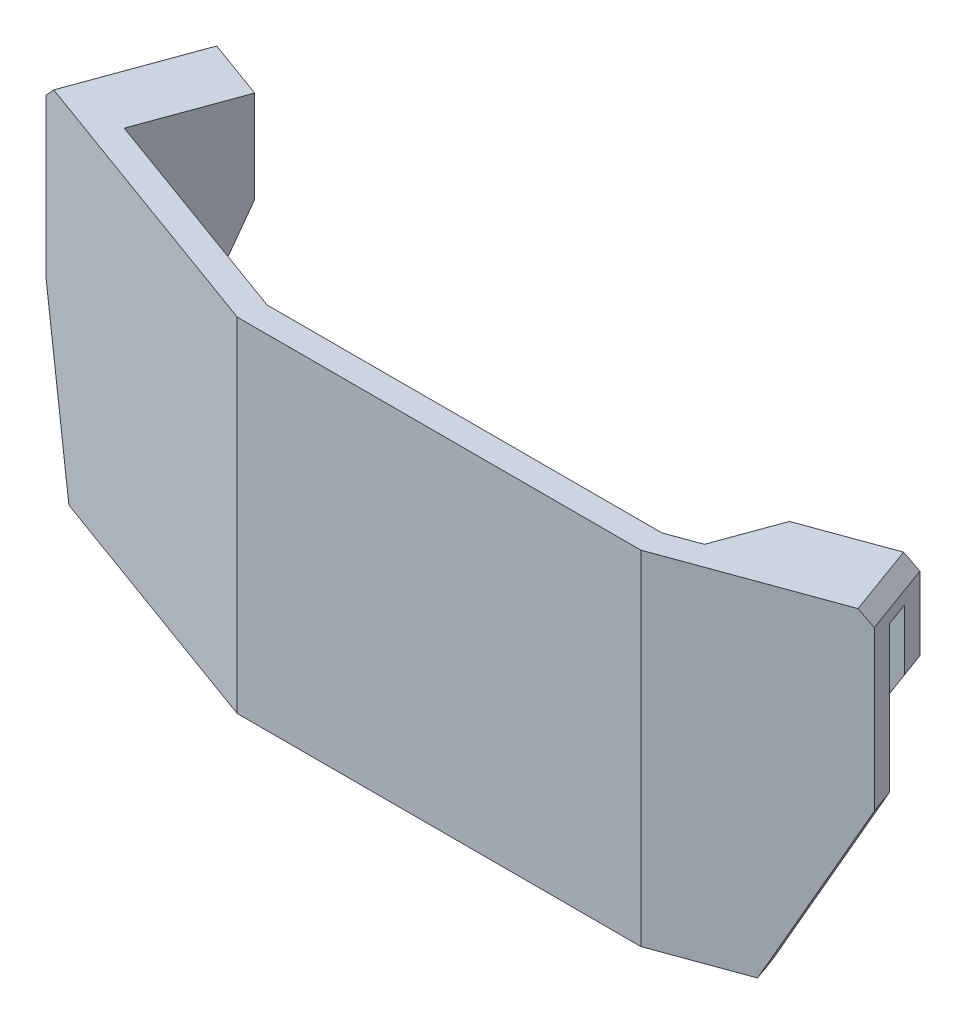
ISO-10303-21;
HEADER;
FILE_DESCRIPTION(('STEP AP214'),'2;1');
FILE_NAME('part.step','',(''),(''),'','','');
FILE_SCHEMA(('AUTOMOTIVE_DESIGN { 1 0 10303 214 1 1 1 1 }'));
ENDSEC;
DATA;
#1=APPLICATION_CONTEXT('core data for automotive mechanical design processes');
#2=APPLICATION_PROTOCOL_DEFINITION('international standard','automotive_design',2000,#1);
#3=PRODUCT_CONTEXT('',#1,'mechanical');
#4=PRODUCT('Part','Part','',(#3));
#5=PRODUCT_RELATED_PRODUCT_CATEGORY('part','',(#4));
#6=PRODUCT_DEFINITION_FORMATION('','',#4);
#7=PRODUCT_DEFINITION_CONTEXT('part definition',#1,'design');
#8=PRODUCT_DEFINITION('design','',#6,#7);
#9=PRODUCT_DEFINITION_SHAPE('','',#8);
#10=(LENGTH_UNIT() NAMED_UNIT(*) SI_UNIT(.MILLI.,.METRE.));
#11=(NAMED_UNIT(*) PLANE_ANGLE_UNIT() SI_UNIT($,.RADIAN.));
#12=(NAMED_UNIT(*) SI_UNIT($,.STERADIAN.) SOLID_ANGLE_UNIT());
#13=UNCERTAINTY_MEASURE_WITH_UNIT(LENGTH_MEASURE(1.E-05),#10,'distance_accuracy_value','');
#14=(GEOMETRIC_REPRESENTATION_CONTEXT(3) GLOBAL_UNCERTAINTY_ASSIGNED_CONTEXT((#13)) GLOBAL_UNIT_ASSIGNED_CONTEXT((#10,
#11,#12)) REPRESENTATION_CONTEXT('',''));
#15=CARTESIAN_POINT('',(0.,0.,0.));
#16=DIRECTION('',(0.,0.,1.));
#17=DIRECTION('',(1.,0.,0.));
#18=AXIS2_PLACEMENT_3D('',#15,#16,#17);
#19=CARTESIAN_POINT('',(0.,0.,0.));
#20=DIRECTION('',(0.,1.,0.));
#21=DIRECTION('',(0.,0.,1.));
#22=AXIS2_PLACEMENT_3D('',#19,#20,#21);
#23=PLANE('',#22);
#24=DIRECTION('',(-0.939692620785903,0.,0.342020143325683));
#25=VECTOR('',#24,1.);
#26=CARTESIAN_POINT('',(27.9629996487587,0.,-6.65645346904802));
#27=LINE('',#26,#25);
#28=CARTESIAN_POINT('',(27.9629996487587,0.,-6.65645346904802));
#29=VERTEX_POINT('',#28);
#30=CARTESIAN_POINT('',(18.8684672194286,0.,-3.346314370203));
#31=VERTEX_POINT('',#30);
#32=EDGE_CURVE('E490',#29,#31,#27,.T.);
#33=ORIENTED_EDGE('',*,*,#32,.F.);
#34=DIRECTION('',(-0.342020143325684,0.,-0.939692620785903));
#35=VECTOR('',#34,1.);
#36=CARTESIAN_POINT('',(27.2789593621074,0.,-8.53583871061982));
#37=LINE('',#36,#35);
#38=CARTESIAN_POINT('',(28.6470399354101,0.,-4.77706822747623));
#39=VERTEX_POINT('',#38);
#40=EDGE_CURVE('E324',#39,#29,#37,.T.);
#41=ORIENTED_EDGE('',*,*,#40,.F.);
#42=DIRECTION('',(0.939692620785903,0.,-0.342020143325684));
#43=VECTOR('',#42,1.);
#44=CARTESIAN_POINT('',(17.975516043037,0.,-0.892951176391627));
#45=LINE('',#44,#43);
#46=CARTESIAN_POINT('',(17.975516043037,0.,-0.892951176391627));
#47=VERTEX_POINT('',#46);
#48=EDGE_CURVE('E307',#47,#39,#45,.T.);
#49=ORIENTED_EDGE('',*,*,#48,.F.);
#50=DIRECTION('',(-0.342020143325656,0.,0.939692620785913));
#51=VECTOR('',#50,1.);
#52=CARTESIAN_POINT('',(19.7614183958202,0.,-5.79967756401436));
#53=LINE('',#52,#51);
#54=EDGE_CURVE('E318',#31,#47,#53,.T.);
#55=ORIENTED_EDGE('',*,*,#54,.F.);
#56=EDGE_LOOP('',(#33,#41,#49,#55));
#57=FACE_BOUND('',#56,.T.);
#58=ADVANCED_FACE('F46',(#57),#23,.F.);
#59=DIRECTION('',(0.342020143325655,0.,-0.939692620785913));
#60=VECTOR('',#59,1.);
#61=CARTESIAN_POINT('',(-32.3226334429452,0.,-14.6282970372879));
#62=LINE('',#61,#60);
#63=CARTESIAN_POINT('',(-35.0587945895505,0.,-7.11075607100055));
#64=VERTEX_POINT('',#63);
#65=CARTESIAN_POINT('',(-32.3226334429452,0.,-14.6282970372879));
#66=VERTEX_POINT('',#65);
#67=EDGE_CURVE('E268',#64,#66,#62,.T.);
#68=ORIENTED_EDGE('',*,*,#67,.F.);
#69=DIRECTION('',(0.939692620785913,0.,0.342020143325655));
#70=VECTOR('',#69,1.);
#71=CARTESIAN_POINT('',(-33.1794093479786,0.,-6.42671578434923));
#72=LINE('',#71,#70);
#73=CARTESIAN_POINT('',(-38.8175650726941,0.,-8.47883664430316));
#74=VERTEX_POINT('',#73);
#75=EDGE_CURVE('E280',#74,#64,#72,.T.);
#76=ORIENTED_EDGE('',*,*,#75,.F.);
#77=DIRECTION('',(-0.342020143325655,0.,0.939692620785913));
#78=VECTOR('',#77,1.);
#79=CARTESIAN_POINT('',(-39.5016053593454,0.,-6.59945140273135));
#80=LINE('',#79,#78);
#81=CARTESIAN_POINT('',(-38.1335247860428,0.,-10.358221885875));
#82=VERTEX_POINT('',#81);
#83=EDGE_CURVE('E360',#82,#74,#80,.T.);
#84=ORIENTED_EDGE('',*,*,#83,.F.);
#85=DIRECTION('',(-0.939692620785913,0.,-0.342020143325655));
#86=VECTOR('',#85,1.);
#87=CARTESIAN_POINT('',(-38.1335247860428,0.,-10.358221885875));
#88=LINE('',#87,#86);
#89=CARTESIAN_POINT('',(-36.254139544471,0.,-9.67418159922368));
#90=VERTEX_POINT('',#89);
#91=EDGE_CURVE('E265',#90,#82,#88,.T.);
#92=ORIENTED_EDGE('',*,*,#91,.F.);
#93=DIRECTION('',(-0.342020143325656,0.,0.939692620785913));
#94=VECTOR('',#93,1.);
#95=CARTESIAN_POINT('',(-36.254139544471,0.,-9.67418159922368));
#96=LINE('',#95,#94);
#97=CARTESIAN_POINT('',(-34.202018684517,0.,-15.3123373239392));
#98=VERTEX_POINT('',#97);
#99=EDGE_CURVE('E261',#98,#90,#96,.T.);
#100=ORIENTED_EDGE('',*,*,#99,.F.);
#101=DIRECTION('',(-0.939692620785913,0.,-0.342020143325655));
#102=VECTOR('',#101,1.);
#103=CARTESIAN_POINT('',(-36.0814039260889,0.,-15.9963776105905));
#104=LINE('',#103,#102);
#105=EDGE_CURVE('E356',#66,#98,#104,.T.);
#106=ORIENTED_EDGE('',*,*,#105,.F.);
#107=EDGE_LOOP('',(#68,#76,#84,#92,#100,#106));
#108=FACE_BOUND('',#107,.T.);
#109=ADVANCED_FACE('F538',(#108),#23,.F.);
#110=CARTESIAN_POINT('',(-33.1794093479786,2.,-6.42671578434923));
#111=DIRECTION('',(-0.342020143325655,0.,0.939692620785913));
#112=DIRECTION('',(0.939692620785913,0.,0.342020143325655));
#113=AXIS2_PLACEMENT_3D('',#110,#111,#112);
#114=PLANE('',#113);
#115=DIRECTION('',(0.939692620785913,0.,0.342020143325655));
#116=VECTOR('',#115,1.);
#117=CARTESIAN_POINT('',(-38.8175650726941,-25.,-8.47883664430316));
#118=LINE('',#117,#116);
#119=CARTESIAN_POINT('',(-35.9984872103364,-25.,-7.45277621432619));
#120=VERTEX_POINT('',#119);
#121=CARTESIAN_POINT('',(-15.5221528492257,-25.,0.));
#122=VERTEX_POINT('',#121);
#123=EDGE_CURVE('E281',#120,#122,#118,.T.);
#124=ORIENTED_EDGE('',*,*,#123,.F.);
#125=DIRECTION('',(0.203847950435901,-0.976187060183953,0.0741945862748368));
#126=VECTOR('',#125,1.);
#127=CARTESIAN_POINT('',(-35.9984872103364,-25.,-7.4527762143262));
#128=LINE('',#127,#126);
#129=CARTESIAN_POINT('',(-38.8175650726941,-11.5,-8.47883664430316));
#130=VERTEX_POINT('',#129);
#131=EDGE_CURVE('E553',#130,#120,#128,.T.);
#132=ORIENTED_EDGE('',*,*,#131,.F.);
#133=DIRECTION('',(0.,1.,0.));
#134=VECTOR('',#133,1.);
#135=CARTESIAN_POINT('',(-38.8175650726941,-25.,-8.47883664430316));
#136=LINE('',#135,#134);
#137=EDGE_CURVE('E315',#130,#74,#136,.T.);
#138=ORIENTED_EDGE('',*,*,#137,.T.);
#139=ORIENTED_EDGE('',*,*,#75,.T.);
#140=DIRECTION('',(0.,1.,0.));
#141=VECTOR('',#140,1.);
#142=CARTESIAN_POINT('',(-35.0587945895505,-11.5,-7.11075607100055));
#143=LINE('',#142,#141);
#144=CARTESIAN_POINT('',(-35.0587945895505,-11.5,-7.11075607100055));
#145=VERTEX_POINT('',#144);
#146=EDGE_CURVE('E493',#145,#64,#143,.T.);
#147=ORIENTED_EDGE('',*,*,#146,.F.);
#148=DIRECTION('',(-0.939692620785913,0.,-0.342020143325656));
#149=VECTOR('',#148,1.);
#150=CARTESIAN_POINT('',(-35.0587945895505,-11.5,-7.11075607100055));
#151=LINE('',#150,#149);
#152=CARTESIAN_POINT('',(-33.1794093479786,-11.5,-6.42671578434923));
#153=VERTEX_POINT('',#152);
#154=EDGE_CURVE('E513',#153,#145,#151,.T.);
#155=ORIENTED_EDGE('',*,*,#154,.F.);
#156=DIRECTION('',(0.,-1.,0.));
#157=VECTOR('',#156,1.);
#158=CARTESIAN_POINT('',(-33.1794093479786,2.,-6.42671578434923));
#159=LINE('',#158,#157);
#160=CARTESIAN_POINT('',(-33.1794093479786,2.,-6.42671578434923));
#161=VERTEX_POINT('',#160);
#162=EDGE_CURVE('E391',#161,#153,#159,.T.);
#163=ORIENTED_EDGE('',*,*,#162,.F.);
#164=DIRECTION('',(-0.939692620785913,0.,-0.342020143325655));
#165=VECTOR('',#164,1.);
#166=CARTESIAN_POINT('',(-33.1794093479786,2.,-6.42671578434923));
#167=LINE('',#166,#165);
#168=CARTESIAN_POINT('',(-15.5221528492257,2.,0.));
#169=VERTEX_POINT('',#168);
#170=EDGE_CURVE('E330',#169,#161,#167,.T.);
#171=ORIENTED_EDGE('',*,*,#170,.F.);
#172=DIRECTION('',(0.,-1.,0.));
#173=VECTOR('',#172,1.);
#174=CARTESIAN_POINT('',(-15.5221528492257,2.,0.));
#175=LINE('',#174,#173);
#176=EDGE_CURVE('E395',#169,#122,#175,.T.);
#177=ORIENTED_EDGE('',*,*,#176,.T.);
#178=EDGE_LOOP('',(#124,#132,#138,#139,#147,#155,#163,#171,#177));
#179=FACE_BOUND('',#178,.T.);
#180=ADVANCED_FACE('F529',(#179),#114,.F.);
#181=CARTESIAN_POINT('',(19.7614183958202,2.,-5.79967756401436));
#182=DIRECTION('',(0.939692620785913,0.,0.342020143325656));
#183=DIRECTION('',(0.342020143325656,0.,-0.939692620785913));
#184=AXIS2_PLACEMENT_3D('',#181,#182,#183);
#185=PLANE('',#184);
#186=DIRECTION('',(0.,-1.,0.));
#187=VECTOR('',#186,1.);
#188=CARTESIAN_POINT('',(19.7614183958202,2.,-5.79967756401436));
#189=LINE('',#188,#187);
#190=CARTESIAN_POINT('',(19.7614183958202,2.,-5.79967756401436));
#191=VERTEX_POINT('',#190);
#192=CARTESIAN_POINT('',(19.7614183958202,-11.5,-5.79967756401436));
#193=VERTEX_POINT('',#192);
#194=EDGE_CURVE('E353',#191,#193,#189,.T.);
#195=ORIENTED_EDGE('',*,*,#194,.T.);
#196=DIRECTION('',(0.342020143325661,0.,-0.939692620785911));
#197=VECTOR('',#196,1.);
#198=CARTESIAN_POINT('',(18.8684672194286,-11.5,-3.346314370203));
#199=LINE('',#198,#197);
#200=CARTESIAN_POINT('',(18.8684672194286,-11.5,-3.346314370203));
#201=VERTEX_POINT('',#200);
#202=EDGE_CURVE('E494',#201,#193,#199,.T.);
#203=ORIENTED_EDGE('',*,*,#202,.F.);
#204=DIRECTION('',(0.,1.,0.));
#205=VECTOR('',#204,1.);
#206=CARTESIAN_POINT('',(18.8684672194286,-11.5,-3.346314370203));
#207=LINE('',#206,#205);
#208=EDGE_CURVE('E485',#201,#31,#207,.T.);
#209=ORIENTED_EDGE('',*,*,#208,.T.);
#210=ORIENTED_EDGE('',*,*,#54,.T.);
#211=DIRECTION('',(0.,-1.,0.));
#212=VECTOR('',#211,1.);
#213=CARTESIAN_POINT('',(17.975516043037,2.,-0.892951176391627));
#214=LINE('',#213,#212);
#215=CARTESIAN_POINT('',(17.975516043037,2.,-0.892951176391627));
#216=VERTEX_POINT('',#215);
#217=EDGE_CURVE('E312',#216,#47,#214,.T.);
#218=ORIENTED_EDGE('',*,*,#217,.F.);
#219=DIRECTION('',(-0.342020143325656,0.,0.939692620785913));
#220=VECTOR('',#219,1.);
#221=CARTESIAN_POINT('',(19.7614183958202,2.,-5.79967756401436));
#222=LINE('',#221,#220);
#223=EDGE_CURVE('E319',#191,#216,#222,.T.);
#224=ORIENTED_EDGE('',*,*,#223,.F.);
#225=EDGE_LOOP('',(#195,#203,#209,#210,#218,#224));
#226=FACE_BOUND('',#225,.T.);
#227=ADVANCED_FACE('F602',(#226),#185,.F.);
#228=CARTESIAN_POINT('',(17.975516043037,2.,-0.892951176391627));
#229=DIRECTION('',(0.342020143325684,0.,0.939692620785903));
#230=DIRECTION('',(0.939692620785903,0.,-0.342020143325684));
#231=AXIS2_PLACEMENT_3D('',#228,#229,#230);
#232=PLANE('',#231);
#233=DIRECTION('',(0.,1.,0.));
#234=VECTOR('',#233,1.);
#235=CARTESIAN_POINT('',(28.6470399354101,-25.,-4.77706822747623));
#236=LINE('',#235,#234);
#237=CARTESIAN_POINT('',(28.6470399354101,-11.5,-4.77706822747622));
#238=VERTEX_POINT('',#237);
#239=EDGE_CURVE('E303',#238,#39,#236,.T.);
#240=ORIENTED_EDGE('',*,*,#239,.F.);
#241=DIRECTION('',(0.440288906105862,0.883439277829366,-0.160252056300169));
#242=VECTOR('',#241,1.);
#243=CARTESIAN_POINT('',(21.9189032297007,-25.,-2.32822673452402));
#244=LINE('',#243,#242);
#245=CARTESIAN_POINT('',(21.9189032297007,-25.,-2.32822673452402));
#246=VERTEX_POINT('',#245);
#247=EDGE_CURVE('E566',#246,#238,#244,.T.);
#248=ORIENTED_EDGE('',*,*,#247,.F.);
#249=DIRECTION('',(0.939692620785903,0.,-0.342020143325684));
#250=VECTOR('',#249,1.);
#251=CARTESIAN_POINT('',(15.5221528492257,-25.,0.));
#252=LINE('',#251,#250);
#253=CARTESIAN_POINT('',(15.5221528492257,-25.,0.));
#254=VERTEX_POINT('',#253);
#255=EDGE_CURVE('E288',#254,#246,#252,.T.);
#256=ORIENTED_EDGE('',*,*,#255,.F.);
#257=DIRECTION('',(0.,-1.,0.));
#258=VECTOR('',#257,1.);
#259=CARTESIAN_POINT('',(15.5221528492257,2.,0.));
#260=LINE('',#259,#258);
#261=CARTESIAN_POINT('',(15.5221528492257,2.,0.));
#262=VERTEX_POINT('',#261);
#263=EDGE_CURVE('E399',#262,#254,#260,.T.);
#264=ORIENTED_EDGE('',*,*,#263,.F.);
#265=DIRECTION('',(-0.939692620785903,0.,0.342020143325684));
#266=VECTOR('',#265,1.);
#267=CARTESIAN_POINT('',(17.975516043037,2.,-0.892951176391627));
#268=LINE('',#267,#266);
#269=EDGE_CURVE('E323',#216,#262,#268,.T.);
#270=ORIENTED_EDGE('',*,*,#269,.F.);
#271=ORIENTED_EDGE('',*,*,#217,.T.);
#272=ORIENTED_EDGE('',*,*,#48,.T.);
#273=EDGE_LOOP('',(#240,#248,#256,#264,#270,#271,#272));
#274=FACE_BOUND('',#273,.T.);
#275=ADVANCED_FACE('F589',(#274),#232,.F.);
#276=CARTESIAN_POINT('',(-15.5221528492257,2.,0.));
#277=DIRECTION('',(0.,0.,1.));
#278=DIRECTION('',(1.,0.,0.));
#279=AXIS2_PLACEMENT_3D('',#276,#277,#278);
#280=PLANE('',#279);
#281=ORIENTED_EDGE('',*,*,#263,.T.);
#282=DIRECTION('',(1.,0.,0.));
#283=VECTOR('',#282,1.);
#284=CARTESIAN_POINT('',(-15.5221528492257,-25.,0.));
#285=LINE('',#284,#283);
#286=EDGE_CURVE('E284',#122,#254,#285,.T.);
#287=ORIENTED_EDGE('',*,*,#286,.F.);
#288=ORIENTED_EDGE('',*,*,#176,.F.);
#289=DIRECTION('',(-1.,0.,0.));
#290=VECTOR('',#289,1.);
#291=CARTESIAN_POINT('',(-15.5221528492257,2.,0.));
#292=LINE('',#291,#290);
#293=EDGE_CURVE('E327',#262,#169,#292,.T.);
#294=ORIENTED_EDGE('',*,*,#293,.F.);
#295=EDGE_LOOP('',(#281,#287,#288,#294));
#296=FACE_BOUND('',#295,.T.);
#297=ADVANCED_FACE('F615',(#296),#280,.F.);
#298=CARTESIAN_POINT('',(-30.4432482013734,2.,-13.9442567506365));
#299=DIRECTION('',(-0.939692620785913,0.,-0.342020143325655));
#300=DIRECTION('',(-0.342020143325655,0.,0.939692620785913));
#301=AXIS2_PLACEMENT_3D('',#298,#299,#300);
#302=PLANE('',#301);
#303=DIRECTION('',(-0.342020143325655,0.,0.939692620785913));
#304=VECTOR('',#303,1.);
#305=CARTESIAN_POINT('',(-33.1794093479786,-11.5,-6.42671578434923));
#306=LINE('',#305,#304);
#307=CARTESIAN_POINT('',(-31.4693086313504,-11.5,-11.1251788882788));
#308=VERTEX_POINT('',#307);
#309=EDGE_CURVE('E509',#308,#153,#306,.T.);
#310=ORIENTED_EDGE('',*,*,#309,.F.);
#311=DIRECTION('',(-0.148002741756807,-0.901523057468274,0.406634190994219));
#312=VECTOR('',#311,1.);
#313=CARTESIAN_POINT('',(-31.4693086313504,-11.5,-11.1251788882788));
#314=LINE('',#313,#312);
#315=CARTESIAN_POINT('',(-30.4432482013734,-5.24999999999999,-13.9442567506365));
#316=VERTEX_POINT('',#315);
#317=EDGE_CURVE('E71',#316,#308,#314,.T.);
#318=ORIENTED_EDGE('',*,*,#317,.F.);
#319=DIRECTION('',(0.,-1.,0.));
#320=VECTOR('',#319,1.);
#321=CARTESIAN_POINT('',(-30.4432482013734,2.,-13.9442567506365));
#322=LINE('',#321,#320);
#323=CARTESIAN_POINT('',(-30.4432482013734,2.,-13.9442567506365));
#324=VERTEX_POINT('',#323);
#325=EDGE_CURVE('E387',#324,#316,#322,.T.);
#326=ORIENTED_EDGE('',*,*,#325,.F.);
#327=DIRECTION('',(0.342020143325655,0.,-0.939692620785913));
#328=VECTOR('',#327,1.);
#329=CARTESIAN_POINT('',(-30.4432482013734,2.,-13.9442567506365));
#330=LINE('',#329,#328);
#331=EDGE_CURVE('E333',#161,#324,#330,.T.);
#332=ORIENTED_EDGE('',*,*,#331,.F.);
#333=ORIENTED_EDGE('',*,*,#162,.T.);
#334=EDGE_LOOP('',(#310,#318,#326,#332,#333));
#335=FACE_BOUND('',#334,.T.);
#336=ADVANCED_FACE('F620',(#335),#302,.F.);
#337=CARTESIAN_POINT('',(-36.0814039260889,2.,-15.9963776105905));
#338=DIRECTION('',(-0.342020143325655,0.,0.939692620785913));
#339=DIRECTION('',(0.939692620785914,0.,0.342020143325655));
#340=AXIS2_PLACEMENT_3D('',#337,#338,#339);
#341=PLANE('',#340);
#342=ORIENTED_EDGE('',*,*,#325,.T.);
#343=DIRECTION('',(-0.939692620785913,0.,-0.342020143325655));
#344=VECTOR('',#343,1.);
#345=CARTESIAN_POINT('',(-23.9286295998202,-5.24999999999999,-11.5731294920744));
#346=LINE('',#345,#344);
#347=CARTESIAN_POINT('',(-32.3226334429452,-5.24999999999999,-14.6282970372878));
#348=VERTEX_POINT('',#347);
#349=EDGE_CURVE('E543',#316,#348,#346,.T.);
#350=ORIENTED_EDGE('',*,*,#349,.T.);
#351=DIRECTION('',(0.,1.,0.));
#352=VECTOR('',#351,1.);
#353=CARTESIAN_POINT('',(-32.3226334429452,-11.5,-14.6282970372879));
#354=LINE('',#353,#352);
#355=EDGE_CURVE('E506',#348,#66,#354,.T.);
#356=ORIENTED_EDGE('',*,*,#355,.T.);
#357=ORIENTED_EDGE('',*,*,#105,.T.);
#358=DIRECTION('',(0.,1.,0.));
#359=VECTOR('',#358,1.);
#360=CARTESIAN_POINT('',(-34.202018684517,-11.5,-15.3123373239392));
#361=LINE('',#360,#359);
#362=CARTESIAN_POINT('',(-34.2020186845171,-5.24999999999999,-15.3123373239392));
#363=VERTEX_POINT('',#362);
#364=EDGE_CURVE('E274',#363,#98,#361,.T.);
#365=ORIENTED_EDGE('',*,*,#364,.F.);
#366=CARTESIAN_POINT('',(-36.0814039260889,-5.24999999999999,-15.9963776105905));
#367=VERTEX_POINT('',#366);
#368=EDGE_CURVE('E433',#363,#367,#346,.T.);
#369=ORIENTED_EDGE('',*,*,#368,.T.);
#370=DIRECTION('',(0.,-1.,0.));
#371=VECTOR('',#370,1.);
#372=CARTESIAN_POINT('',(-36.0814039260889,2.,-15.9963776105905));
#373=LINE('',#372,#371);
#374=CARTESIAN_POINT('',(-36.0814039260889,1.00000000000002,-15.9963776105905));
#375=VERTEX_POINT('',#374);
#376=EDGE_CURVE('E247',#375,#367,#373,.T.);
#377=ORIENTED_EDGE('',*,*,#376,.F.);
#378=DIRECTION('',(0.664463024388683,0.707106781186543,0.241844762647967));
#379=VECTOR('',#378,1.);
#380=CARTESIAN_POINT('',(-35.141711305303,2.,-15.6543574672648));
#381=LINE('',#380,#379);
#382=CARTESIAN_POINT('',(-35.141711305303,2.,-15.6543574672648));
#383=VERTEX_POINT('',#382);
#384=EDGE_CURVE('E11',#375,#383,#381,.T.);
#385=ORIENTED_EDGE('',*,*,#384,.T.);
#386=DIRECTION('',(-0.939692620785913,0.,-0.342020143325655));
#387=VECTOR('',#386,1.);
#388=CARTESIAN_POINT('',(-36.0814039260889,2.,-15.9963776105905));
#389=LINE('',#388,#387);
#390=EDGE_CURVE('E336',#324,#383,#389,.T.);
#391=ORIENTED_EDGE('',*,*,#390,.F.);
#392=EDGE_LOOP('',(#342,#350,#356,#357,#365,#369,#377,#385,#391));
#393=FACE_BOUND('',#392,.T.);
#394=ADVANCED_FACE('F430',(#393),#341,.F.);
#395=CARTESIAN_POINT('',(-39.5016053593454,2.,-6.59945140273135));
#396=DIRECTION('',(0.939692620785913,0.,0.342020143325655));
#397=DIRECTION('',(0.342020143325655,0.,-0.939692620785913));
#398=AXIS2_PLACEMENT_3D('',#395,#396,#397);
#399=PLANE('',#398);
#400=ORIENTED_EDGE('',*,*,#376,.T.);
#401=DIRECTION('',(0.148002741756807,0.901523057468274,-0.406634190994219));
#402=VECTOR('',#401,1.);
#403=CARTESIAN_POINT('',(-37.1074643560658,-11.5,-13.1772997482327));
#404=LINE('',#403,#402);
#405=CARTESIAN_POINT('',(-37.1074643560658,-11.5,-13.1772997482327));
#406=VERTEX_POINT('',#405);
#407=EDGE_CURVE('E232',#406,#367,#404,.T.);
#408=ORIENTED_EDGE('',*,*,#407,.F.);
#409=DIRECTION('',(0.342020143325656,0.,-0.939692620785913));
#410=VECTOR('',#409,1.);
#411=CARTESIAN_POINT('',(-36.0814039260889,-11.5,-15.9963776105905));
#412=LINE('',#411,#410);
#413=CARTESIAN_POINT('',(-38.1335247860428,-11.5,-10.358221885875));
#414=VERTEX_POINT('',#413);
#415=EDGE_CURVE('E244',#414,#406,#412,.T.);
#416=ORIENTED_EDGE('',*,*,#415,.F.);
#417=DIRECTION('',(0.,1.,0.));
#418=VECTOR('',#417,1.);
#419=CARTESIAN_POINT('',(-38.1335247860428,-11.5,-10.358221885875));
#420=LINE('',#419,#418);
#421=EDGE_CURVE('E277',#414,#82,#420,.T.);
#422=ORIENTED_EDGE('',*,*,#421,.T.);
#423=ORIENTED_EDGE('',*,*,#83,.T.);
#424=ORIENTED_EDGE('',*,*,#137,.F.);
#425=DIRECTION('',(-0.342020143325655,0.,0.939692620785913));
#426=VECTOR('',#425,1.);
#427=CARTESIAN_POINT('',(-34.0876601976733,-11.5,-21.4741434845918));
#428=LINE('',#427,#426);
#429=CARTESIAN_POINT('',(-39.5016053593454,-11.5,-6.59945140273135));
#430=VERTEX_POINT('',#429);
#431=EDGE_CURVE('E561',#130,#430,#428,.T.);
#432=ORIENTED_EDGE('',*,*,#431,.T.);
#433=DIRECTION('',(0.,-1.,0.));
#434=VECTOR('',#433,1.);
#435=CARTESIAN_POINT('',(-39.5016053593454,2.,-6.59945140273135));
#436=LINE('',#435,#434);
#437=CARTESIAN_POINT('',(-39.5016053593454,1.00000000000002,-6.59945140273135));
#438=VERTEX_POINT('',#437);
#439=EDGE_CURVE('E382',#438,#430,#436,.T.);
#440=ORIENTED_EDGE('',*,*,#439,.F.);
#441=DIRECTION('',(0.342020143325655,0.,-0.939692620785913));
#442=VECTOR('',#441,1.);
#443=CARTESIAN_POINT('',(-36.0814039260889,1.00000000000002,-15.9963776105905));
#444=LINE('',#443,#442);
#445=EDGE_CURVE('E56',#438,#375,#444,.T.);
#446=ORIENTED_EDGE('',*,*,#445,.T.);
#447=EDGE_LOOP('',(#400,#408,#416,#422,#423,#424,#432,#440,#446));
#448=FACE_BOUND('',#447,.T.);
#449=ADVANCED_FACE('F242',(#448),#399,.F.);
#450=CARTESIAN_POINT('',(-39.5016053593454,2.,-6.59945140273135));
#451=DIRECTION('',(0.342020143325655,0.,-0.939692620785913));
#452=DIRECTION('',(-0.939692620785913,0.,-0.342020143325655));
#453=AXIS2_PLACEMENT_3D('',#450,#451,#452);
#454=PLANE('',#453);
#455=DIRECTION('',(0.939692620785913,0.,0.342020143325655));
#456=VECTOR('',#455,1.);
#457=CARTESIAN_POINT('',(-39.5016053593454,2.,-6.59945140273135));
#458=LINE('',#457,#456);
#459=CARTESIAN_POINT('',(-38.5619127385595,2.,-6.2574312594057));
#460=VERTEX_POINT('',#459);
#461=CARTESIAN_POINT('',(-15.8748068106426,2.,1.99999999999998));
#462=VERTEX_POINT('',#461);
#463=EDGE_CURVE('E340',#460,#462,#458,.T.);
#464=ORIENTED_EDGE('',*,*,#463,.F.);
#465=DIRECTION('',(-0.664463024388683,-0.707106781186543,-0.241844762647967));
#466=VECTOR('',#465,1.);
#467=CARTESIAN_POINT('',(-38.5619127385595,2.,-6.2574312594057));
#468=LINE('',#467,#466);
#469=EDGE_CURVE('E421',#460,#438,#468,.T.);
#470=ORIENTED_EDGE('',*,*,#469,.T.);
#471=ORIENTED_EDGE('',*,*,#439,.T.);
#472=DIRECTION('',(-0.203847950435901,0.976187060183953,-0.0741945862748369));
#473=VECTOR('',#472,1.);
#474=CARTESIAN_POINT('',(-36.6825274969877,-25.,-5.57339097275439));
#475=LINE('',#474,#473);
#476=CARTESIAN_POINT('',(-36.6825274969877,-25.,-5.57339097275439));
#477=VERTEX_POINT('',#476);
#478=EDGE_CURVE('E549',#477,#430,#475,.T.);
#479=ORIENTED_EDGE('',*,*,#478,.F.);
#480=DIRECTION('',(-0.939692620785913,0.,-0.342020143325655));
#481=VECTOR('',#480,1.);
#482=CARTESIAN_POINT('',(-39.5016053593454,-25.,-6.59945140273135));
#483=LINE('',#482,#481);
#484=CARTESIAN_POINT('',(-15.8748068106426,-25.,1.99999999999998));
#485=VERTEX_POINT('',#484);
#486=EDGE_CURVE('E299',#485,#477,#483,.T.);
#487=ORIENTED_EDGE('',*,*,#486,.F.);
#488=DIRECTION('',(0.,-1.,0.));
#489=VECTOR('',#488,1.);
#490=CARTESIAN_POINT('',(-15.8748068106426,2.,1.99999999999998));
#491=LINE('',#490,#489);
#492=EDGE_CURVE('E379',#462,#485,#491,.T.);
#493=ORIENTED_EDGE('',*,*,#492,.F.);
#494=EDGE_LOOP('',(#464,#470,#471,#479,#487,#493));
#495=FACE_BOUND('',#494,.T.);
#496=ADVANCED_FACE('F440',(#495),#454,.F.);
#497=CARTESIAN_POINT('',(-15.8748068106426,2.,1.99999999999998));
#498=DIRECTION('',(0.,0.,-1.));
#499=DIRECTION('',(-1.,0.,0.));
#500=AXIS2_PLACEMENT_3D('',#497,#498,#499);
#501=PLANE('',#500);
#502=ORIENTED_EDGE('',*,*,#492,.T.);
#503=DIRECTION('',(-1.,0.,0.));
#504=VECTOR('',#503,1.);
#505=CARTESIAN_POINT('',(-15.8748068106426,-25.,1.99999999999998));
#506=LINE('',#505,#504);
#507=CARTESIAN_POINT('',(15.8748068106427,-25.,1.99999999999998));
#508=VERTEX_POINT('',#507);
#509=EDGE_CURVE('E295',#508,#485,#506,.T.);
#510=ORIENTED_EDGE('',*,*,#509,.F.);
#511=DIRECTION('',(0.,-1.,0.));
#512=VECTOR('',#511,1.);
#513=CARTESIAN_POINT('',(15.8748068106427,2.,1.99999999999998));
#514=LINE('',#513,#512);
#515=CARTESIAN_POINT('',(15.8748068106427,2.,1.99999999999998));
#516=VERTEX_POINT('',#515);
#517=EDGE_CURVE('E375',#516,#508,#514,.T.);
#518=ORIENTED_EDGE('',*,*,#517,.F.);
#519=DIRECTION('',(1.,0.,0.));
#520=VECTOR('',#519,1.);
#521=CARTESIAN_POINT('',(-15.8748068106426,2.,1.99999999999998));
#522=LINE('',#521,#520);
#523=EDGE_CURVE('E343',#462,#516,#522,.T.);
#524=ORIENTED_EDGE('',*,*,#523,.F.);
#525=EDGE_LOOP('',(#502,#510,#518,#524));
#526=FACE_BOUND('',#525,.T.);
#527=ADVANCED_FACE('F447',(#526),#501,.F.);
#528=CARTESIAN_POINT('',(15.8748068106427,2.,1.99999999999998));
#529=DIRECTION('',(-0.342020143325684,0.,-0.939692620785903));
#530=DIRECTION('',(-0.939692620785903,0.,0.342020143325684));
#531=AXIS2_PLACEMENT_3D('',#528,#529,#530);
#532=PLANE('',#531);
#533=DIRECTION('',(0.,-1.,0.));
#534=VECTOR('',#533,1.);
#535=CARTESIAN_POINT('',(29.3310802220615,2.,-2.89768298590442));
#536=LINE('',#535,#534);
#537=CARTESIAN_POINT('',(29.3310802220615,0.999999999999992,-2.89768298590442));
#538=VERTEX_POINT('',#537);
#539=CARTESIAN_POINT('',(29.3310802220615,-11.5,-2.89768298590442));
#540=VERTEX_POINT('',#539);
#541=EDGE_CURVE('E372',#538,#540,#536,.T.);
#542=ORIENTED_EDGE('',*,*,#541,.F.);
#543=DIRECTION('',(-0.66446302438867,0.707106781186549,0.241844762647986));
#544=VECTOR('',#543,1.);
#545=CARTESIAN_POINT('',(28.3913876012756,2.,-2.55566284257873));
#546=LINE('',#545,#544);
#547=CARTESIAN_POINT('',(28.3913876012756,2.,-2.55566284257874));
#548=VERTEX_POINT('',#547);
#549=EDGE_CURVE('E418',#538,#548,#546,.T.);
#550=ORIENTED_EDGE('',*,*,#549,.T.);
#551=DIRECTION('',(0.939692620785903,0.,-0.342020143325684));
#552=VECTOR('',#551,1.);
#553=CARTESIAN_POINT('',(15.8748068106427,2.,1.99999999999998));
#554=LINE('',#553,#552);
#555=EDGE_CURVE('E346',#516,#548,#554,.T.);
#556=ORIENTED_EDGE('',*,*,#555,.F.);
#557=ORIENTED_EDGE('',*,*,#517,.T.);
#558=DIRECTION('',(-0.939692620785903,0.,0.342020143325684));
#559=VECTOR('',#558,1.);
#560=CARTESIAN_POINT('',(15.8748068106427,-25.,1.99999999999998));
#561=LINE('',#560,#559);
#562=CARTESIAN_POINT('',(22.6029435163521,-25.,-0.448841492952218));
#563=VERTEX_POINT('',#562);
#564=EDGE_CURVE('E292',#563,#508,#561,.T.);
#565=ORIENTED_EDGE('',*,*,#564,.F.);
#566=DIRECTION('',(-0.440288906105862,-0.883439277829366,0.160252056300169));
#567=VECTOR('',#566,1.);
#568=CARTESIAN_POINT('',(22.6029435163521,-25.,-0.448841492952217));
#569=LINE('',#568,#567);
#570=EDGE_CURVE('E556',#540,#563,#569,.T.);
#571=ORIENTED_EDGE('',*,*,#570,.F.);
#572=EDGE_LOOP('',(#542,#550,#556,#557,#565,#571));
#573=FACE_BOUND('',#572,.T.);
#574=ADVANCED_FACE('F584',(#573),#532,.F.);
#575=CARTESIAN_POINT('',(27.2789593621074,2.,-8.53583871061982));
#576=DIRECTION('',(-0.939692620785903,0.,0.342020143325684));
#577=DIRECTION('',(0.342020143325684,0.,0.939692620785903));
#578=AXIS2_PLACEMENT_3D('',#575,#576,#577);
#579=PLANE('',#578);
#580=DIRECTION('',(0.,-1.,0.));
#581=VECTOR('',#580,1.);
#582=CARTESIAN_POINT('',(27.2789593621074,2.,-8.53583871061982));
#583=LINE('',#582,#581);
#584=CARTESIAN_POINT('',(27.2789593621074,0.999999999999992,-8.53583871061982));
#585=VERTEX_POINT('',#584);
#586=CARTESIAN_POINT('',(27.2789593621074,-4.75,-8.53583871061982));
#587=VERTEX_POINT('',#586);
#588=EDGE_CURVE('E369',#585,#587,#583,.T.);
#589=ORIENTED_EDGE('',*,*,#588,.F.);
#590=DIRECTION('',(0.342020143325684,0.,0.939692620785903));
#591=VECTOR('',#590,1.);
#592=CARTESIAN_POINT('',(29.3310802220615,0.999999999999992,-2.89768298590442));
#593=LINE('',#592,#591);
#594=EDGE_CURVE('E415',#585,#538,#593,.T.);
#595=ORIENTED_EDGE('',*,*,#594,.T.);
#596=ORIENTED_EDGE('',*,*,#541,.T.);
#597=DIRECTION('',(0.342020143325684,0.,0.939692620785903));
#598=VECTOR('',#597,1.);
#599=CARTESIAN_POINT('',(23.4205664801643,-11.5,-19.1366860291424));
#600=LINE('',#599,#598);
#601=EDGE_CURVE('E572',#238,#540,#600,.T.);
#602=ORIENTED_EDGE('',*,*,#601,.F.);
#603=ORIENTED_EDGE('',*,*,#239,.T.);
#604=ORIENTED_EDGE('',*,*,#40,.T.);
#605=DIRECTION('',(0.,1.,0.));
#606=VECTOR('',#605,1.);
#607=CARTESIAN_POINT('',(27.9629996487587,-11.5,-6.65645346904802));
#608=LINE('',#607,#606);
#609=CARTESIAN_POINT('',(27.9629996487587,-4.75,-6.65645346904802));
#610=VERTEX_POINT('',#609);
#611=EDGE_CURVE('E468',#610,#29,#608,.T.);
#612=ORIENTED_EDGE('',*,*,#611,.F.);
#613=DIRECTION('',(-0.342020143325683,0.,-0.939692620785903));
#614=VECTOR('',#613,1.);
#615=CARTESIAN_POINT('',(30.646550372193,-4.75,0.716541547548378));
#616=LINE('',#615,#614);
#617=EDGE_CURVE('E467',#610,#587,#616,.T.);
#618=ORIENTED_EDGE('',*,*,#617,.T.);
#619=EDGE_LOOP('',(#589,#595,#596,#602,#603,#604,#612,#618));
#620=FACE_BOUND('',#619,.T.);
#621=ADVANCED_FACE('F464',(#620),#579,.F.);
#622=CARTESIAN_POINT('',(19.7614183958202,2.,-5.79967756401436));
#623=DIRECTION('',(0.342020143325683,0.,0.939692620785903));
#624=DIRECTION('',(0.939692620785903,0.,-0.342020143325683));
#625=AXIS2_PLACEMENT_3D('',#622,#623,#624);
#626=PLANE('',#625);
#627=DIRECTION('',(-0.939692620785903,0.,0.342020143325683));
#628=VECTOR('',#627,1.);
#629=CARTESIAN_POINT('',(19.7614183958202,2.,-5.79967756401436));
#630=LINE('',#629,#628);
#631=CARTESIAN_POINT('',(26.3392667413215,2.,-8.19381856729413));
#632=VERTEX_POINT('',#631);
#633=EDGE_CURVE('E350',#632,#191,#630,.T.);
#634=ORIENTED_EDGE('',*,*,#633,.F.);
#635=DIRECTION('',(0.66446302438867,-0.707106781186549,-0.241844762647985));
#636=VECTOR('',#635,1.);
#637=CARTESIAN_POINT('',(26.3392667413215,2.,-8.19381856729413));
#638=LINE('',#637,#636);
#639=EDGE_CURVE('E412',#632,#585,#638,.T.);
#640=ORIENTED_EDGE('',*,*,#639,.T.);
#641=ORIENTED_EDGE('',*,*,#588,.T.);
#642=DIRECTION('',(0.479057544225552,0.860291533634175,-0.174362686598774));
#643=VECTOR('',#642,1.);
#644=CARTESIAN_POINT('',(23.5201888789638,-11.5,-7.16775813731709));
#645=LINE('',#644,#643);
#646=CARTESIAN_POINT('',(23.5201888789638,-11.5,-7.16775813731709));
#647=VERTEX_POINT('',#646);
#648=EDGE_CURVE('E478',#647,#587,#645,.T.);
#649=ORIENTED_EDGE('',*,*,#648,.F.);
#650=DIRECTION('',(0.939692620785903,0.,-0.342020143325683));
#651=VECTOR('',#650,1.);
#652=CARTESIAN_POINT('',(19.7614183958202,-11.5,-5.79967756401436));
#653=LINE('',#652,#651);
#654=EDGE_CURVE('E497',#193,#647,#653,.T.);
#655=ORIENTED_EDGE('',*,*,#654,.F.);
#656=ORIENTED_EDGE('',*,*,#194,.F.);
#657=EDGE_LOOP('',(#634,#640,#641,#649,#655,#656));
#658=FACE_BOUND('',#657,.T.);
#659=ADVANCED_FACE('F458',(#658),#626,.F.);
#660=CARTESIAN_POINT('',(0.,2.,0.));
#661=DIRECTION('',(0.,1.,0.));
#662=DIRECTION('',(0.,0.,1.));
#663=AXIS2_PLACEMENT_3D('',#660,#661,#662);
#664=PLANE('',#663);
#665=ORIENTED_EDGE('',*,*,#555,.T.);
#666=DIRECTION('',(-0.342020143325684,0.,-0.939692620785903));
#667=VECTOR('',#666,1.);
#668=CARTESIAN_POINT('',(26.3392667413215,2.,-8.19381856729413));
#669=LINE('',#668,#667);
#670=EDGE_CURVE('E408',#548,#632,#669,.T.);
#671=ORIENTED_EDGE('',*,*,#670,.T.);
#672=ORIENTED_EDGE('',*,*,#633,.T.);
#673=ORIENTED_EDGE('',*,*,#223,.T.);
#674=ORIENTED_EDGE('',*,*,#269,.T.);
#675=ORIENTED_EDGE('',*,*,#293,.T.);
#676=ORIENTED_EDGE('',*,*,#170,.T.);
#677=ORIENTED_EDGE('',*,*,#331,.T.);
#678=ORIENTED_EDGE('',*,*,#390,.T.);
#679=DIRECTION('',(-0.342020143325655,0.,0.939692620785913));
#680=VECTOR('',#679,1.);
#681=CARTESIAN_POINT('',(-38.5619127385595,2.,-6.2574312594057));
#682=LINE('',#681,#680);
#683=EDGE_CURVE('E311',#383,#460,#682,.T.);
#684=ORIENTED_EDGE('',*,*,#683,.T.);
#685=ORIENTED_EDGE('',*,*,#463,.T.);
#686=ORIENTED_EDGE('',*,*,#523,.T.);
#687=EDGE_LOOP('',(#665,#671,#672,#673,#674,#675,#676,#677,#678,#684,#685,#686));
#688=FACE_BOUND('',#687,.T.);
#689=ADVANCED_FACE('F437',(#688),#664,.T.);
#690=CARTESIAN_POINT('',(0.,-25.,0.));
#691=DIRECTION('',(0.,1.,0.));
#692=DIRECTION('',(0.,0.,1.));
#693=AXIS2_PLACEMENT_3D('',#690,#691,#692);
#694=PLANE('',#693);
#695=ORIENTED_EDGE('',*,*,#486,.T.);
#696=DIRECTION('',(-0.342020143325655,0.,0.939692620785913));
#697=VECTOR('',#696,1.);
#698=CARTESIAN_POINT('',(-31.2685823353155,-25.,-20.4480830546149));
#699=LINE('',#698,#697);
#700=EDGE_CURVE('E557',#120,#477,#699,.T.);
#701=ORIENTED_EDGE('',*,*,#700,.F.);
#702=ORIENTED_EDGE('',*,*,#123,.T.);
#703=ORIENTED_EDGE('',*,*,#286,.T.);
#704=ORIENTED_EDGE('',*,*,#255,.T.);
#705=DIRECTION('',(0.342020143325684,0.,0.939692620785903));
#706=VECTOR('',#705,1.);
#707=CARTESIAN_POINT('',(16.6924297744549,-25.,-16.6878445361902));
#708=LINE('',#707,#706);
#709=EDGE_CURVE('E569',#246,#563,#708,.T.);
#710=ORIENTED_EDGE('',*,*,#709,.T.);
#711=ORIENTED_EDGE('',*,*,#564,.T.);
#712=ORIENTED_EDGE('',*,*,#509,.T.);
#713=EDGE_LOOP('',(#695,#701,#702,#703,#704,#710,#711,#712));
#714=FACE_BOUND('',#713,.T.);
#715=ADVANCED_FACE('F586',(#714),#694,.F.);
#716=CARTESIAN_POINT('',(-38.1335247860428,-11.5,-10.358221885875));
#717=DIRECTION('',(0.342020143325655,0.,-0.939692620785913));
#718=DIRECTION('',(-0.939692620785913,0.,-0.342020143325655));
#719=AXIS2_PLACEMENT_3D('',#716,#717,#718);
#720=PLANE('',#719);
#721=ORIENTED_EDGE('',*,*,#91,.T.);
#722=ORIENTED_EDGE('',*,*,#421,.F.);
#723=DIRECTION('',(-0.939692620785913,0.,-0.342020143325655));
#724=VECTOR('',#723,1.);
#725=CARTESIAN_POINT('',(-38.1335247860428,-11.5,-10.358221885875));
#726=LINE('',#725,#724);
#727=CARTESIAN_POINT('',(-36.254139544471,-11.5,-9.67418159922368));
#728=VERTEX_POINT('',#727);
#729=EDGE_CURVE('E252',#728,#414,#726,.T.);
#730=ORIENTED_EDGE('',*,*,#729,.F.);
#731=DIRECTION('',(0.,1.,0.));
#732=VECTOR('',#731,1.);
#733=CARTESIAN_POINT('',(-36.254139544471,-11.5,-9.67418159922368));
#734=LINE('',#733,#732);
#735=EDGE_CURVE('E259',#728,#90,#734,.T.);
#736=ORIENTED_EDGE('',*,*,#735,.T.);
#737=EDGE_LOOP('',(#721,#722,#730,#736));
#738=FACE_BOUND('',#737,.T.);
#739=ADVANCED_FACE('F661',(#738),#720,.F.);
#740=CARTESIAN_POINT('',(-36.254139544471,-11.5,-9.67418159922368));
#741=DIRECTION('',(-0.939692620785913,0.,-0.342020143325655));
#742=DIRECTION('',(-0.342020143325655,0.,0.939692620785913));
#743=AXIS2_PLACEMENT_3D('',#740,#741,#742);
#744=PLANE('',#743);
#745=DIRECTION('',(-0.342020143325656,0.,0.939692620785913));
#746=VECTOR('',#745,1.);
#747=CARTESIAN_POINT('',(-36.254139544471,-11.5,-9.67418159922368));
#748=LINE('',#747,#746);
#749=CARTESIAN_POINT('',(-35.228079114494,-11.5,-12.4932594615814));
#750=VERTEX_POINT('',#749);
#751=EDGE_CURVE('E255',#750,#728,#748,.T.);
#752=ORIENTED_EDGE('',*,*,#751,.F.);
#753=DIRECTION('',(0.148002741756807,0.901523057468274,-0.406634190994219));
#754=VECTOR('',#753,1.);
#755=CARTESIAN_POINT('',(-35.4202152678317,-12.6703511053316,-11.9653697188252));
#756=LINE('',#755,#754);
#757=EDGE_CURVE('E63',#750,#363,#756,.T.);
#758=ORIENTED_EDGE('',*,*,#757,.T.);
#759=ORIENTED_EDGE('',*,*,#364,.T.);
#760=ORIENTED_EDGE('',*,*,#99,.T.);
#761=ORIENTED_EDGE('',*,*,#735,.F.);
#762=EDGE_LOOP('',(#752,#758,#759,#760,#761));
#763=FACE_BOUND('',#762,.T.);
#764=ADVANCED_FACE('F657',(#763),#744,.F.);
#765=CARTESIAN_POINT('',(0.,-11.5,0.));
#766=DIRECTION('',(0.,1.,0.));
#767=DIRECTION('',(0.,0.,1.));
#768=AXIS2_PLACEMENT_3D('',#765,#766,#767);
#769=PLANE('',#768);
#770=ORIENTED_EDGE('',*,*,#415,.T.);
#771=DIRECTION('',(-0.939692620785913,0.,-0.342020143325655));
#772=VECTOR('',#771,1.);
#773=CARTESIAN_POINT('',(-24.9546900297971,-11.5,-8.75405162971662));
#774=LINE('',#773,#772);
#775=EDGE_CURVE('E229',#750,#406,#774,.T.);
#776=ORIENTED_EDGE('',*,*,#775,.F.);
#777=ORIENTED_EDGE('',*,*,#751,.T.);
#778=ORIENTED_EDGE('',*,*,#729,.T.);
#779=EDGE_LOOP('',(#770,#776,#777,#778));
#780=FACE_BOUND('',#779,.T.);
#781=ADVANCED_FACE('F250',(#780),#769,.F.);
#782=CARTESIAN_POINT('',(-32.3226334429452,-11.5,-14.6282970372879));
#783=DIRECTION('',(0.939692620785913,0.,0.342020143325655));
#784=DIRECTION('',(0.342020143325655,0.,-0.939692620785913));
#785=AXIS2_PLACEMENT_3D('',#782,#783,#784);
#786=PLANE('',#785);
#787=ORIENTED_EDGE('',*,*,#355,.F.);
#788=DIRECTION('',(-0.148002741756807,-0.901523057468274,0.406634190994219));
#789=VECTOR('',#788,1.);
#790=CARTESIAN_POINT('',(-33.1565577195845,-10.3296488946684,-12.3371089176863));
#791=LINE('',#790,#789);
#792=CARTESIAN_POINT('',(-33.3486938729222,-11.5,-11.8092191749301));
#793=VERTEX_POINT('',#792);
#794=EDGE_CURVE('E544',#348,#793,#791,.T.);
#795=ORIENTED_EDGE('',*,*,#794,.T.);
#796=DIRECTION('',(0.342020143325655,0.,-0.939692620785913));
#797=VECTOR('',#796,1.);
#798=CARTESIAN_POINT('',(-32.3226334429452,-11.5,-14.6282970372879));
#799=LINE('',#798,#797);
#800=EDGE_CURVE('E516',#145,#793,#799,.T.);
#801=ORIENTED_EDGE('',*,*,#800,.F.);
#802=ORIENTED_EDGE('',*,*,#146,.T.);
#803=ORIENTED_EDGE('',*,*,#67,.T.);
#804=EDGE_LOOP('',(#787,#795,#801,#802,#803));
#805=FACE_BOUND('',#804,.T.);
#806=ADVANCED_FACE('F534',(#805),#786,.F.);
#807=CARTESIAN_POINT('',(0.,-11.5,0.));
#808=DIRECTION('',(0.,1.,0.));
#809=DIRECTION('',(0.,0.,1.));
#810=AXIS2_PLACEMENT_3D('',#807,#808,#809);
#811=PLANE('',#810);
#812=ORIENTED_EDGE('',*,*,#800,.T.);
#813=EDGE_CURVE('E238',#308,#793,#774,.T.);
#814=ORIENTED_EDGE('',*,*,#813,.F.);
#815=ORIENTED_EDGE('',*,*,#309,.T.);
#816=ORIENTED_EDGE('',*,*,#154,.T.);
#817=EDGE_LOOP('',(#812,#814,#815,#816));
#818=FACE_BOUND('',#817,.T.);
#819=ADVANCED_FACE('F524',(#818),#811,.F.);
#820=CARTESIAN_POINT('',(27.9629996487587,-11.5,-6.65645346904802));
#821=DIRECTION('',(-0.342020143325683,0.,-0.939692620785903));
#822=DIRECTION('',(-0.939692620785903,0.,0.342020143325683));
#823=AXIS2_PLACEMENT_3D('',#820,#821,#822);
#824=PLANE('',#823);
#825=DIRECTION('',(-0.939692620785903,0.,0.342020143325683));
#826=VECTOR('',#825,1.);
#827=CARTESIAN_POINT('',(27.9629996487587,-11.5,-6.65645346904802));
#828=LINE('',#827,#826);
#829=CARTESIAN_POINT('',(24.2042291656151,-11.5,-5.2883728957453));
#830=VERTEX_POINT('',#829);
#831=EDGE_CURVE('E489',#830,#201,#828,.T.);
#832=ORIENTED_EDGE('',*,*,#831,.F.);
#833=DIRECTION('',(-0.479057544225552,-0.860291533634175,0.174362686598774));
#834=VECTOR('',#833,1.);
#835=CARTESIAN_POINT('',(24.2042291656151,-11.5,-5.28837289574529));
#836=LINE('',#835,#834);
#837=EDGE_CURVE('E472',#610,#830,#836,.T.);
#838=ORIENTED_EDGE('',*,*,#837,.F.);
#839=ORIENTED_EDGE('',*,*,#611,.T.);
#840=ORIENTED_EDGE('',*,*,#32,.T.);
#841=ORIENTED_EDGE('',*,*,#208,.F.);
#842=EDGE_LOOP('',(#832,#838,#839,#840,#841));
#843=FACE_BOUND('',#842,.T.);
#844=ADVANCED_FACE('F599',(#843),#824,.F.);
#845=CARTESIAN_POINT('',(0.,-11.5,0.));
#846=DIRECTION('',(0.,-1.,0.));
#847=DIRECTION('',(0.,0.,-1.));
#848=AXIS2_PLACEMENT_3D('',#845,#846,#847);
#849=PLANE('',#848);
#850=DIRECTION('',(-0.342020143325683,0.,-0.939692620785903));
#851=VECTOR('',#850,1.);
#852=CARTESIAN_POINT('',(26.8877798890494,-11.5,2.08462212085111));
#853=LINE('',#852,#851);
#854=EDGE_CURVE('E473',#830,#647,#853,.T.);
#855=ORIENTED_EDGE('',*,*,#854,.F.);
#856=ORIENTED_EDGE('',*,*,#831,.T.);
#857=ORIENTED_EDGE('',*,*,#202,.T.);
#858=ORIENTED_EDGE('',*,*,#654,.T.);
#859=EDGE_LOOP('',(#855,#856,#857,#858));
#860=FACE_BOUND('',#859,.T.);
#861=ADVANCED_FACE('F608',(#860),#849,.T.);
#862=CARTESIAN_POINT('',(26.8877798890494,-11.5,2.08462212085111));
#863=DIRECTION('',(-0.808409605880622,0.509802390301732,0.294237033635432));
#864=DIRECTION('',(-0.5334153672143,-0.845853442399825,0.));
#865=AXIS2_PLACEMENT_3D('',#862,#863,#864);
#866=PLANE('',#865);
#867=ORIENTED_EDGE('',*,*,#837,.T.);
#868=ORIENTED_EDGE('',*,*,#854,.T.);
#869=ORIENTED_EDGE('',*,*,#648,.T.);
#870=ORIENTED_EDGE('',*,*,#617,.F.);
#871=EDGE_LOOP('',(#867,#868,#869,#870));
#872=FACE_BOUND('',#871,.T.);
#873=ADVANCED_FACE('F609',(#872),#866,.F.);
#874=CARTESIAN_POINT('',(16.6924297744549,-25.,-16.6878445361902));
#875=DIRECTION('',(-0.830161370288682,0.468545667345595,0.302154028422738));
#876=DIRECTION('',(-0.491519733991289,-0.87086643700233,0.));
#877=AXIS2_PLACEMENT_3D('',#874,#875,#876);
#878=PLANE('',#877);
#879=ORIENTED_EDGE('',*,*,#247,.T.);
#880=ORIENTED_EDGE('',*,*,#601,.T.);
#881=ORIENTED_EDGE('',*,*,#570,.T.);
#882=ORIENTED_EDGE('',*,*,#709,.F.);
#883=EDGE_LOOP('',(#879,#880,#881,#882));
#884=FACE_BOUND('',#883,.T.);
#885=ADVANCED_FACE('F580',(#884),#878,.F.);
#886=CARTESIAN_POINT('',(-31.2685823353155,-25.,-20.4480830546149));
#887=DIRECTION('',(0.917315776961555,0.216930457818656,0.333875638236766));
#888=DIRECTION('',(0.342020143325655,0.,-0.939692620785913));
#889=AXIS2_PLACEMENT_3D('',#886,#887,#888);
#890=PLANE('',#889);
#891=ORIENTED_EDGE('',*,*,#131,.T.);
#892=ORIENTED_EDGE('',*,*,#700,.T.);
#893=ORIENTED_EDGE('',*,*,#478,.T.);
#894=ORIENTED_EDGE('',*,*,#431,.F.);
#895=EDGE_LOOP('',(#891,#892,#893,#894));
#896=FACE_BOUND('',#895,.T.);
#897=ADVANCED_FACE('F716',(#896),#890,.F.);
#898=CARTESIAN_POINT('',(25.8916003577076,2.,-9.42377184772219));
#899=DIRECTION('',(0.664463024388672,0.707106781186546,-0.241844762647987));
#900=DIRECTION('',(0.342020143325684,0.,0.939692620785903));
#901=AXIS2_PLACEMENT_3D('',#898,#899,#900);
#902=PLANE('',#901);
#903=ORIENTED_EDGE('',*,*,#549,.F.);
#904=ORIENTED_EDGE('',*,*,#594,.F.);
#905=ORIENTED_EDGE('',*,*,#639,.F.);
#906=ORIENTED_EDGE('',*,*,#670,.F.);
#907=EDGE_LOOP('',(#903,#904,#905,#906));
#908=FACE_BOUND('',#907,.T.);
#909=ADVANCED_FACE('F454',(#908),#902,.T.);
#910=CARTESIAN_POINT('',(-36.0621254949919,2.,-13.1255402645488));
#911=DIRECTION('',(-0.664463024388674,0.707106781186552,-0.241844762647964));
#912=DIRECTION('',(0.342020143325655,0.,-0.939692620785913));
#913=AXIS2_PLACEMENT_3D('',#910,#911,#912);
#914=PLANE('',#913);
#915=ORIENTED_EDGE('',*,*,#384,.F.);
#916=ORIENTED_EDGE('',*,*,#445,.F.);
#917=ORIENTED_EDGE('',*,*,#469,.F.);
#918=ORIENTED_EDGE('',*,*,#683,.F.);
#919=EDGE_LOOP('',(#915,#916,#917,#918));
#920=FACE_BOUND('',#919,.T.);
#921=ADVANCED_FACE('F49',(#920),#914,.T.);
#922=CARTESIAN_POINT('',(-24.9546900297971,-11.5,-8.75405162971662));
#923=DIRECTION('',(-0.308339045326682,0.43273106758477,0.847154564571292));
#924=DIRECTION('',(0.,-0.890545009203168,0.454895138008013));
#925=AXIS2_PLACEMENT_3D('',#922,#923,#924);
#926=PLANE('',#925);
#927=ORIENTED_EDGE('',*,*,#349,.F.);
#928=ORIENTED_EDGE('',*,*,#317,.T.);
#929=ORIENTED_EDGE('',*,*,#813,.T.);
#930=ORIENTED_EDGE('',*,*,#794,.F.);
#931=EDGE_LOOP('',(#927,#928,#929,#930));
#932=FACE_BOUND('',#931,.T.);
#933=ADVANCED_FACE('F686',(#932),#926,.F.);
#934=ORIENTED_EDGE('',*,*,#775,.T.);
#935=ORIENTED_EDGE('',*,*,#407,.T.);
#936=ORIENTED_EDGE('',*,*,#368,.F.);
#937=ORIENTED_EDGE('',*,*,#757,.F.);
#938=EDGE_LOOP('',(#934,#935,#936,#937));
#939=FACE_BOUND('',#938,.T.);
#940=ADVANCED_FACE('F231',(#939),#926,.F.);
#941=CLOSED_SHELL('',(#58,#109,#180,#227,#275,#297,#336,#394,#449,#496,#527,#574,#621,#659,#689,
#715,#739,#764,#781,#806,#819,#844,#861,#873,#885,#897,#909,#921,#933,#940));
#942=MANIFOLD_SOLID_BREP('B2',#941);
#943=ADVANCED_BREP_SHAPE_REPRESENTATION('',(#18,#942),#14);
#944=SHAPE_DEFINITION_REPRESENTATION(#9,#943);
ENDSEC;
END-ISO-10303-21;
